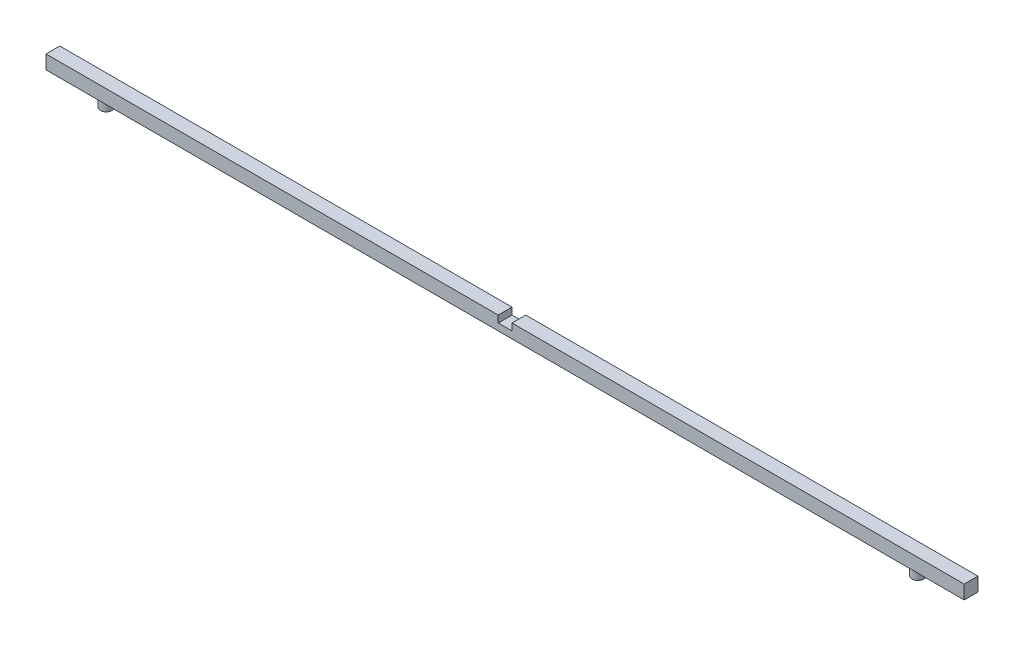
ISO-10303-21;
HEADER;
FILE_DESCRIPTION(('STEP AP214'),'2;1');
FILE_NAME('part.step','',(''),(''),'','','');
FILE_SCHEMA(('AUTOMOTIVE_DESIGN { 1 0 10303 214 1 1 1 1 }'));
ENDSEC;
DATA;
#1=APPLICATION_CONTEXT('core data for automotive mechanical design processes');
#2=APPLICATION_PROTOCOL_DEFINITION('international standard','automotive_design',2000,#1);
#3=PRODUCT_CONTEXT('',#1,'mechanical');
#4=PRODUCT('Part','Part','',(#3));
#5=PRODUCT_RELATED_PRODUCT_CATEGORY('part','',(#4));
#6=PRODUCT_DEFINITION_FORMATION('','',#4);
#7=PRODUCT_DEFINITION_CONTEXT('part definition',#1,'design');
#8=PRODUCT_DEFINITION('design','',#6,#7);
#9=PRODUCT_DEFINITION_SHAPE('','',#8);
#10=(LENGTH_UNIT() NAMED_UNIT(*) SI_UNIT(.MILLI.,.METRE.));
#11=(NAMED_UNIT(*) PLANE_ANGLE_UNIT() SI_UNIT($,.RADIAN.));
#12=(NAMED_UNIT(*) SI_UNIT($,.STERADIAN.) SOLID_ANGLE_UNIT());
#13=UNCERTAINTY_MEASURE_WITH_UNIT(LENGTH_MEASURE(1.E-05),#10,'distance_accuracy_value','');
#14=(GEOMETRIC_REPRESENTATION_CONTEXT(3) GLOBAL_UNCERTAINTY_ASSIGNED_CONTEXT((#13)) GLOBAL_UNIT_ASSIGNED_CONTEXT((#10,
#11,#12)) REPRESENTATION_CONTEXT('',''));
#15=CARTESIAN_POINT('',(0.,0.,0.));
#16=DIRECTION('',(0.,0.,1.));
#17=DIRECTION('',(1.,0.,0.));
#18=AXIS2_PLACEMENT_3D('',#15,#16,#17);
#19=CARTESIAN_POINT('',(-1000.,0.,30.));
#20=DIRECTION('',(0.,1.,0.));
#21=DIRECTION('',(-1.,0.,0.));
#22=AXIS2_PLACEMENT_3D('',#19,#20,#21);
#23=PLANE('',#22);
#24=CARTESIAN_POINT('',(-883.883476483184,0.,15.));
#25=DIRECTION('',(0.,1.,0.));
#26=DIRECTION('',(-1.,0.,0.));
#27=AXIS2_PLACEMENT_3D('',#24,#25,#26);
#28=CIRCLE('',#27,12.5);
#29=CARTESIAN_POINT('',(-896.383476483184,0.,15.));
#30=VERTEX_POINT('',#29);
#31=EDGE_CURVE('E49',#30,#30,#28,.F.);
#32=ORIENTED_EDGE('',*,*,#31,.F.);
#33=EDGE_LOOP('',(#32));
#34=FACE_BOUND('',#33,.T.);
#35=DIRECTION('',(1.,0.,0.));
#36=VECTOR('',#35,1.);
#37=CARTESIAN_POINT('',(-1000.,0.,0.));
#38=LINE('',#37,#36);
#39=CARTESIAN_POINT('',(-1000.,0.,0.));
#40=VERTEX_POINT('',#39);
#41=CARTESIAN_POINT('',(1000.,2.4980018054066E-13,0.));
#42=VERTEX_POINT('',#41);
#43=EDGE_CURVE('E146',#40,#42,#38,.T.);
#44=ORIENTED_EDGE('',*,*,#43,.T.);
#45=DIRECTION('',(0.,0.,-1.));
#46=VECTOR('',#45,1.);
#47=CARTESIAN_POINT('',(1000.,2.4980018054066E-13,30.));
#48=LINE('',#47,#46);
#49=CARTESIAN_POINT('',(1000.,2.4980018054066E-13,30.));
#50=VERTEX_POINT('',#49);
#51=EDGE_CURVE('E180',#50,#42,#48,.T.);
#52=ORIENTED_EDGE('',*,*,#51,.F.);
#53=DIRECTION('',(1.,0.,0.));
#54=VECTOR('',#53,1.);
#55=CARTESIAN_POINT('',(-1000.,0.,30.));
#56=LINE('',#55,#54);
#57=CARTESIAN_POINT('',(-1000.,0.,30.));
#58=VERTEX_POINT('',#57);
#59=EDGE_CURVE('E101',#58,#50,#56,.T.);
#60=ORIENTED_EDGE('',*,*,#59,.F.);
#61=DIRECTION('',(0.,0.,-1.));
#62=VECTOR('',#61,1.);
#63=CARTESIAN_POINT('',(-1000.,0.,30.));
#64=LINE('',#63,#62);
#65=EDGE_CURVE('E184',#58,#40,#64,.T.);
#66=ORIENTED_EDGE('',*,*,#65,.T.);
#67=EDGE_LOOP('',(#44,#52,#60,#66));
#68=FACE_BOUND('',#67,.T.);
#69=CARTESIAN_POINT('',(883.883476483184,2.35922392732846E-13,15.0000000000001));
#70=DIRECTION('',(0.,1.,0.));
#71=DIRECTION('',(-1.,0.,0.));
#72=AXIS2_PLACEMENT_3D('',#69,#70,#71);
#73=CIRCLE('',#72,12.5);
#74=CARTESIAN_POINT('',(871.383476483184,2.34361141604467E-13,15.0000000000001));
#75=VERTEX_POINT('',#74);
#76=EDGE_CURVE('E11',#75,#75,#73,.F.);
#77=ORIENTED_EDGE('',*,*,#76,.F.);
#78=EDGE_LOOP('',(#77));
#79=FACE_BOUND('',#78,.T.);
#80=ADVANCED_FACE('F39',(#34,#68,#79),#23,.F.);
#81=CARTESIAN_POINT('',(-1000.,30.,30.));
#82=DIRECTION('',(1.,0.,0.));
#83=DIRECTION('',(0.,0.,-1.));
#84=AXIS2_PLACEMENT_3D('',#81,#82,#83);
#85=PLANE('',#84);
#86=DIRECTION('',(0.,-1.,0.));
#87=VECTOR('',#86,1.);
#88=CARTESIAN_POINT('',(-1000.,30.,0.));
#89=LINE('',#88,#87);
#90=CARTESIAN_POINT('',(-1000.,30.,0.));
#91=VERTEX_POINT('',#90);
#92=EDGE_CURVE('E142',#91,#40,#89,.T.);
#93=ORIENTED_EDGE('',*,*,#92,.T.);
#94=ORIENTED_EDGE('',*,*,#65,.F.);
#95=DIRECTION('',(0.,-1.,0.));
#96=VECTOR('',#95,1.);
#97=CARTESIAN_POINT('',(-1000.,30.,30.));
#98=LINE('',#97,#96);
#99=CARTESIAN_POINT('',(-1000.,30.,30.));
#100=VERTEX_POINT('',#99);
#101=EDGE_CURVE('E165',#100,#58,#98,.T.);
#102=ORIENTED_EDGE('',*,*,#101,.F.);
#103=DIRECTION('',(0.,0.,-1.));
#104=VECTOR('',#103,1.);
#105=CARTESIAN_POINT('',(-1000.,30.,30.));
#106=LINE('',#105,#104);
#107=EDGE_CURVE('E138',#100,#91,#106,.T.);
#108=ORIENTED_EDGE('',*,*,#107,.T.);
#109=EDGE_LOOP('',(#93,#94,#102,#108));
#110=FACE_BOUND('',#109,.T.);
#111=ADVANCED_FACE('F41',(#110),#85,.F.);
#112=CARTESIAN_POINT('',(1000.,29.9999999999998,30.));
#113=DIRECTION('',(-1.,0.,0.));
#114=DIRECTION('',(0.,0.,1.));
#115=AXIS2_PLACEMENT_3D('',#112,#113,#114);
#116=PLANE('',#115);
#117=DIRECTION('',(0.,1.,0.));
#118=VECTOR('',#117,1.);
#119=CARTESIAN_POINT('',(1000.,29.9999999999998,0.));
#120=LINE('',#119,#118);
#121=CARTESIAN_POINT('',(1000.,29.9999999999998,0.));
#122=VERTEX_POINT('',#121);
#123=EDGE_CURVE('E150',#42,#122,#120,.T.);
#124=ORIENTED_EDGE('',*,*,#123,.T.);
#125=DIRECTION('',(0.,0.,-1.));
#126=VECTOR('',#125,1.);
#127=CARTESIAN_POINT('',(1000.,29.9999999999998,30.));
#128=LINE('',#127,#126);
#129=CARTESIAN_POINT('',(1000.,29.9999999999998,30.));
#130=VERTEX_POINT('',#129);
#131=EDGE_CURVE('E176',#130,#122,#128,.T.);
#132=ORIENTED_EDGE('',*,*,#131,.F.);
#133=DIRECTION('',(0.,1.,0.));
#134=VECTOR('',#133,1.);
#135=CARTESIAN_POINT('',(1000.,29.9999999999998,30.));
#136=LINE('',#135,#134);
#137=EDGE_CURVE('E270',#50,#130,#136,.T.);
#138=ORIENTED_EDGE('',*,*,#137,.F.);
#139=ORIENTED_EDGE('',*,*,#51,.T.);
#140=EDGE_LOOP('',(#124,#132,#138,#139));
#141=FACE_BOUND('',#140,.T.);
#142=ADVANCED_FACE('F251',(#141),#116,.F.);
#143=CARTESIAN_POINT('',(15.,30.,30.));
#144=DIRECTION('',(0.,-1.,0.));
#145=DIRECTION('',(1.,0.,0.));
#146=AXIS2_PLACEMENT_3D('',#143,#144,#145);
#147=PLANE('',#146);
#148=DIRECTION('',(-1.,0.,0.));
#149=VECTOR('',#148,1.);
#150=CARTESIAN_POINT('',(15.,30.,0.));
#151=LINE('',#150,#149);
#152=CARTESIAN_POINT('',(15.,30.,0.));
#153=VERTEX_POINT('',#152);
#154=EDGE_CURVE('E153',#122,#153,#151,.T.);
#155=ORIENTED_EDGE('',*,*,#154,.T.);
#156=DIRECTION('',(0.,0.,-1.));
#157=VECTOR('',#156,1.);
#158=CARTESIAN_POINT('',(15.,30.,30.));
#159=LINE('',#158,#157);
#160=CARTESIAN_POINT('',(15.,30.,30.));
#161=VERTEX_POINT('',#160);
#162=EDGE_CURVE('E172',#161,#153,#159,.T.);
#163=ORIENTED_EDGE('',*,*,#162,.F.);
#164=DIRECTION('',(-1.,0.,0.));
#165=VECTOR('',#164,1.);
#166=CARTESIAN_POINT('',(15.,30.,30.));
#167=LINE('',#166,#165);
#168=EDGE_CURVE('E265',#130,#161,#167,.T.);
#169=ORIENTED_EDGE('',*,*,#168,.F.);
#170=ORIENTED_EDGE('',*,*,#131,.T.);
#171=EDGE_LOOP('',(#155,#163,#169,#170));
#172=FACE_BOUND('',#171,.T.);
#173=ADVANCED_FACE('F247',(#172),#147,.F.);
#174=CARTESIAN_POINT('',(15.,15.,30.));
#175=DIRECTION('',(1.,0.,0.));
#176=DIRECTION('',(0.,1.,0.));
#177=AXIS2_PLACEMENT_3D('',#174,#175,#176);
#178=PLANE('',#177);
#179=DIRECTION('',(0.,-1.,0.));
#180=VECTOR('',#179,1.);
#181=CARTESIAN_POINT('',(15.,15.,0.));
#182=LINE('',#181,#180);
#183=CARTESIAN_POINT('',(15.,15.,0.));
#184=VERTEX_POINT('',#183);
#185=EDGE_CURVE('E156',#153,#184,#182,.T.);
#186=ORIENTED_EDGE('',*,*,#185,.T.);
#187=DIRECTION('',(0.,0.,-1.));
#188=VECTOR('',#187,1.);
#189=CARTESIAN_POINT('',(15.,15.,30.));
#190=LINE('',#189,#188);
#191=CARTESIAN_POINT('',(15.,15.,30.));
#192=VERTEX_POINT('',#191);
#193=EDGE_CURVE('E131',#192,#184,#190,.T.);
#194=ORIENTED_EDGE('',*,*,#193,.F.);
#195=DIRECTION('',(0.,-1.,0.));
#196=VECTOR('',#195,1.);
#197=CARTESIAN_POINT('',(15.,15.,30.));
#198=LINE('',#197,#196);
#199=EDGE_CURVE('E120',#161,#192,#198,.T.);
#200=ORIENTED_EDGE('',*,*,#199,.F.);
#201=ORIENTED_EDGE('',*,*,#162,.T.);
#202=EDGE_LOOP('',(#186,#194,#200,#201));
#203=FACE_BOUND('',#202,.T.);
#204=ADVANCED_FACE('F244',(#203),#178,.F.);
#205=CARTESIAN_POINT('',(-15.,15.,30.));
#206=DIRECTION('',(0.,-1.,0.));
#207=DIRECTION('',(1.,0.,0.));
#208=AXIS2_PLACEMENT_3D('',#205,#206,#207);
#209=PLANE('',#208);
#210=DIRECTION('',(-1.,0.,0.));
#211=VECTOR('',#210,1.);
#212=CARTESIAN_POINT('',(-15.,15.,0.));
#213=LINE('',#212,#211);
#214=CARTESIAN_POINT('',(-15.,15.,0.));
#215=VERTEX_POINT('',#214);
#216=EDGE_CURVE('E129',#184,#215,#213,.T.);
#217=ORIENTED_EDGE('',*,*,#216,.T.);
#218=DIRECTION('',(0.,0.,-1.));
#219=VECTOR('',#218,1.);
#220=CARTESIAN_POINT('',(-15.,15.,30.));
#221=LINE('',#220,#219);
#222=CARTESIAN_POINT('',(-15.,15.,30.));
#223=VERTEX_POINT('',#222);
#224=EDGE_CURVE('E126',#223,#215,#221,.T.);
#225=ORIENTED_EDGE('',*,*,#224,.F.);
#226=DIRECTION('',(-1.,0.,0.));
#227=VECTOR('',#226,1.);
#228=CARTESIAN_POINT('',(-15.,15.,30.));
#229=LINE('',#228,#227);
#230=EDGE_CURVE('E114',#192,#223,#229,.T.);
#231=ORIENTED_EDGE('',*,*,#230,.F.);
#232=ORIENTED_EDGE('',*,*,#193,.T.);
#233=EDGE_LOOP('',(#217,#225,#231,#232));
#234=FACE_BOUND('',#233,.T.);
#235=ADVANCED_FACE('F127',(#234),#209,.F.);
#236=CARTESIAN_POINT('',(-15.,30.,30.));
#237=DIRECTION('',(-1.,0.,0.));
#238=DIRECTION('',(0.,-1.,0.));
#239=AXIS2_PLACEMENT_3D('',#236,#237,#238);
#240=PLANE('',#239);
#241=DIRECTION('',(0.,1.,0.));
#242=VECTOR('',#241,1.);
#243=CARTESIAN_POINT('',(-15.,30.,0.));
#244=LINE('',#243,#242);
#245=CARTESIAN_POINT('',(-15.,30.,0.));
#246=VERTEX_POINT('',#245);
#247=EDGE_CURVE('E86',#215,#246,#244,.T.);
#248=ORIENTED_EDGE('',*,*,#247,.T.);
#249=DIRECTION('',(0.,0.,-1.));
#250=VECTOR('',#249,1.);
#251=CARTESIAN_POINT('',(-15.,30.,30.));
#252=LINE('',#251,#250);
#253=CARTESIAN_POINT('',(-15.,30.,30.));
#254=VERTEX_POINT('',#253);
#255=EDGE_CURVE('E132',#254,#246,#252,.T.);
#256=ORIENTED_EDGE('',*,*,#255,.F.);
#257=DIRECTION('',(0.,1.,0.));
#258=VECTOR('',#257,1.);
#259=CARTESIAN_POINT('',(-15.,30.,30.));
#260=LINE('',#259,#258);
#261=EDGE_CURVE('E118',#223,#254,#260,.T.);
#262=ORIENTED_EDGE('',*,*,#261,.F.);
#263=ORIENTED_EDGE('',*,*,#224,.T.);
#264=EDGE_LOOP('',(#248,#256,#262,#263));
#265=FACE_BOUND('',#264,.T.);
#266=ADVANCED_FACE('F134',(#265),#240,.F.);
#267=CARTESIAN_POINT('',(-1000.,30.,30.));
#268=DIRECTION('',(0.,-1.,0.));
#269=DIRECTION('',(1.,0.,0.));
#270=AXIS2_PLACEMENT_3D('',#267,#268,#269);
#271=PLANE('',#270);
#272=DIRECTION('',(-1.,0.,0.));
#273=VECTOR('',#272,1.);
#274=CARTESIAN_POINT('',(-1000.,30.,0.));
#275=LINE('',#274,#273);
#276=EDGE_CURVE('E92',#246,#91,#275,.T.);
#277=ORIENTED_EDGE('',*,*,#276,.T.);
#278=ORIENTED_EDGE('',*,*,#107,.F.);
#279=DIRECTION('',(-1.,0.,0.));
#280=VECTOR('',#279,1.);
#281=CARTESIAN_POINT('',(-1000.,30.,30.));
#282=LINE('',#281,#280);
#283=EDGE_CURVE('E57',#254,#100,#282,.T.);
#284=ORIENTED_EDGE('',*,*,#283,.F.);
#285=ORIENTED_EDGE('',*,*,#255,.T.);
#286=EDGE_LOOP('',(#277,#278,#284,#285));
#287=FACE_BOUND('',#286,.T.);
#288=ADVANCED_FACE('F234',(#287),#271,.F.);
#289=CARTESIAN_POINT('',(0.,0.,30.));
#290=DIRECTION('',(0.,0.,1.));
#291=DIRECTION('',(1.,0.,0.));
#292=AXIS2_PLACEMENT_3D('',#289,#290,#291);
#293=PLANE('',#292);
#294=ORIENTED_EDGE('',*,*,#101,.T.);
#295=ORIENTED_EDGE('',*,*,#59,.T.);
#296=ORIENTED_EDGE('',*,*,#137,.T.);
#297=ORIENTED_EDGE('',*,*,#168,.T.);
#298=ORIENTED_EDGE('',*,*,#199,.T.);
#299=ORIENTED_EDGE('',*,*,#230,.T.);
#300=ORIENTED_EDGE('',*,*,#261,.T.);
#301=ORIENTED_EDGE('',*,*,#283,.T.);
#302=EDGE_LOOP('',(#294,#295,#296,#297,#298,#299,#300,#301));
#303=FACE_BOUND('',#302,.T.);
#304=ADVANCED_FACE('F116',(#303),#293,.T.);
#305=CARTESIAN_POINT('',(0.,0.,0.));
#306=DIRECTION('',(0.,0.,1.));
#307=DIRECTION('',(1.,0.,0.));
#308=AXIS2_PLACEMENT_3D('',#305,#306,#307);
#309=PLANE('',#308);
#310=ORIENTED_EDGE('',*,*,#92,.F.);
#311=ORIENTED_EDGE('',*,*,#276,.F.);
#312=ORIENTED_EDGE('',*,*,#247,.F.);
#313=ORIENTED_EDGE('',*,*,#216,.F.);
#314=ORIENTED_EDGE('',*,*,#185,.F.);
#315=ORIENTED_EDGE('',*,*,#154,.F.);
#316=ORIENTED_EDGE('',*,*,#123,.F.);
#317=ORIENTED_EDGE('',*,*,#43,.F.);
#318=EDGE_LOOP('',(#310,#311,#312,#313,#314,#315,#316,#317));
#319=FACE_BOUND('',#318,.T.);
#320=ADVANCED_FACE('F217',(#319),#309,.F.);
#321=CARTESIAN_POINT('',(-883.883476483184,-20.0000000000001,15.));
#322=DIRECTION('',(0.,-1.,0.));
#323=DIRECTION('',(1.,0.,0.));
#324=AXIS2_PLACEMENT_3D('',#321,#322,#323);
#325=PLANE('',#324);
#326=CARTESIAN_POINT('',(-883.883476483184,-20.0000000000001,15.));
#327=DIRECTION('',(0.,-1.,0.));
#328=DIRECTION('',(1.,0.,0.));
#329=AXIS2_PLACEMENT_3D('',#326,#327,#328);
#330=CIRCLE('',#329,12.5);
#331=CARTESIAN_POINT('',(-871.383476483184,-20.0000000000001,15.));
#332=VERTEX_POINT('',#331);
#333=EDGE_CURVE('E283',#332,#332,#330,.T.);
#334=ORIENTED_EDGE('',*,*,#333,.T.);
#335=EDGE_LOOP('',(#334));
#336=FACE_BOUND('',#335,.T.);
#337=CARTESIAN_POINT('',(-883.883476483184,-20.0000000000001,15.));
#338=DIRECTION('',(0.,-1.,0.));
#339=DIRECTION('',(1.,0.,0.));
#340=AXIS2_PLACEMENT_3D('',#337,#338,#339);
#341=CIRCLE('',#340,9.99999999999998);
#342=CARTESIAN_POINT('',(-873.883476483184,-20.0000000000001,15.));
#343=VERTEX_POINT('',#342);
#344=EDGE_CURVE('E290',#343,#343,#341,.T.);
#345=ORIENTED_EDGE('',*,*,#344,.F.);
#346=EDGE_LOOP('',(#345));
#347=FACE_BOUND('',#346,.T.);
#348=ADVANCED_FACE('F214',(#336,#347),#325,.T.);
#349=CARTESIAN_POINT('',(-883.883476483184,-20.0000000000001,15.));
#350=DIRECTION('',(0.,1.,0.));
#351=DIRECTION('',(-1.,0.,0.));
#352=AXIS2_PLACEMENT_3D('',#349,#350,#351);
#353=CYLINDRICAL_SURFACE('',#352,12.5);
#354=ORIENTED_EDGE('',*,*,#333,.F.);
#355=EDGE_LOOP('',(#354));
#356=FACE_BOUND('',#355,.T.);
#357=ORIENTED_EDGE('',*,*,#31,.T.);
#358=EDGE_LOOP('',(#357));
#359=FACE_BOUND('',#358,.T.);
#360=ADVANCED_FACE('F190',(#356,#359),#353,.T.);
#361=CARTESIAN_POINT('',(-883.883476483184,14.9999999999999,15.));
#362=DIRECTION('',(0.,-1.,0.));
#363=DIRECTION('',(1.,0.,0.));
#364=AXIS2_PLACEMENT_3D('',#361,#362,#363);
#365=PLANE('',#364);
#366=CARTESIAN_POINT('',(-883.883476483184,14.9999999999999,15.));
#367=DIRECTION('',(0.,-1.,0.));
#368=DIRECTION('',(1.,0.,0.));
#369=AXIS2_PLACEMENT_3D('',#366,#367,#368);
#370=CIRCLE('',#369,9.99999999999998);
#371=CARTESIAN_POINT('',(-873.883476483184,14.9999999999999,15.));
#372=VERTEX_POINT('',#371);
#373=EDGE_CURVE('E147',#372,#372,#370,.T.);
#374=ORIENTED_EDGE('',*,*,#373,.T.);
#375=EDGE_LOOP('',(#374));
#376=FACE_BOUND('',#375,.T.);
#377=ADVANCED_FACE('F221',(#376),#365,.T.);
#378=CARTESIAN_POINT('',(-883.883476483184,14.9999999999999,15.));
#379=DIRECTION('',(0.,-1.,0.));
#380=DIRECTION('',(1.,0.,0.));
#381=AXIS2_PLACEMENT_3D('',#378,#379,#380);
#382=CYLINDRICAL_SURFACE('',#381,9.99999999999998);
#383=ORIENTED_EDGE('',*,*,#373,.F.);
#384=EDGE_LOOP('',(#383));
#385=FACE_BOUND('',#384,.T.);
#386=ORIENTED_EDGE('',*,*,#344,.T.);
#387=EDGE_LOOP('',(#386));
#388=FACE_BOUND('',#387,.T.);
#389=ADVANCED_FACE('F209',(#385,#388),#382,.F.);
#390=CARTESIAN_POINT('',(883.883476483184,-19.9999999999999,15.0000000000001));
#391=DIRECTION('',(0.,1.,0.));
#392=DIRECTION('',(-1.,0.,0.));
#393=AXIS2_PLACEMENT_3D('',#390,#391,#392);
#394=PLANE('',#393);
#395=CARTESIAN_POINT('',(883.883476483184,-19.9999999999999,15.0000000000001));
#396=DIRECTION('',(0.,-1.,0.));
#397=DIRECTION('',(-1.,0.,0.));
#398=AXIS2_PLACEMENT_3D('',#395,#396,#397);
#399=CIRCLE('',#398,12.5);
#400=CARTESIAN_POINT('',(871.383476483184,-19.9999999999999,15.0000000000001));
#401=VERTEX_POINT('',#400);
#402=EDGE_CURVE('E294',#401,#401,#399,.T.);
#403=ORIENTED_EDGE('',*,*,#402,.T.);
#404=EDGE_LOOP('',(#403));
#405=FACE_BOUND('',#404,.T.);
#406=CARTESIAN_POINT('',(883.883476483184,-19.9999999999999,15.0000000000001));
#407=DIRECTION('',(0.,-1.,0.));
#408=DIRECTION('',(-1.,0.,0.));
#409=AXIS2_PLACEMENT_3D('',#406,#407,#408);
#410=CIRCLE('',#409,9.99999999999998);
#411=CARTESIAN_POINT('',(873.883476483184,-19.9999999999999,15.0000000000001));
#412=VERTEX_POINT('',#411);
#413=EDGE_CURVE('E298',#412,#412,#410,.T.);
#414=ORIENTED_EDGE('',*,*,#413,.F.);
#415=EDGE_LOOP('',(#414));
#416=FACE_BOUND('',#415,.T.);
#417=ADVANCED_FACE('F199',(#405,#416),#394,.F.);
#418=CARTESIAN_POINT('',(883.883476483184,-19.9999999999999,15.0000000000001));
#419=DIRECTION('',(0.,1.,0.));
#420=DIRECTION('',(-1.,0.,0.));
#421=AXIS2_PLACEMENT_3D('',#418,#419,#420);
#422=CYLINDRICAL_SURFACE('',#421,12.5);
#423=ORIENTED_EDGE('',*,*,#402,.F.);
#424=EDGE_LOOP('',(#423));
#425=FACE_BOUND('',#424,.T.);
#426=ORIENTED_EDGE('',*,*,#76,.T.);
#427=EDGE_LOOP('',(#426));
#428=FACE_BOUND('',#427,.T.);
#429=ADVANCED_FACE('F196',(#425,#428),#422,.T.);
#430=CARTESIAN_POINT('',(883.883476483184,15.0000000000001,15.));
#431=DIRECTION('',(0.,1.,0.));
#432=DIRECTION('',(-1.,0.,0.));
#433=AXIS2_PLACEMENT_3D('',#430,#431,#432);
#434=PLANE('',#433);
#435=CARTESIAN_POINT('',(883.883476483184,15.0000000000001,15.));
#436=DIRECTION('',(0.,-1.,0.));
#437=DIRECTION('',(-1.,0.,0.));
#438=AXIS2_PLACEMENT_3D('',#435,#436,#437);
#439=CIRCLE('',#438,9.99999999999998);
#440=CARTESIAN_POINT('',(873.883476483184,15.0000000000001,15.));
#441=VERTEX_POINT('',#440);
#442=EDGE_CURVE('E279',#441,#441,#439,.T.);
#443=ORIENTED_EDGE('',*,*,#442,.T.);
#444=EDGE_LOOP('',(#443));
#445=FACE_BOUND('',#444,.T.);
#446=ADVANCED_FACE('F198',(#445),#434,.F.);
#447=CARTESIAN_POINT('',(883.883476483184,15.0000000000001,15.));
#448=DIRECTION('',(0.,-1.,0.));
#449=DIRECTION('',(1.,0.,0.));
#450=AXIS2_PLACEMENT_3D('',#447,#448,#449);
#451=CYLINDRICAL_SURFACE('',#450,9.99999999999998);
#452=ORIENTED_EDGE('',*,*,#442,.F.);
#453=EDGE_LOOP('',(#452));
#454=FACE_BOUND('',#453,.T.);
#455=ORIENTED_EDGE('',*,*,#413,.T.);
#456=EDGE_LOOP('',(#455));
#457=FACE_BOUND('',#456,.T.);
#458=ADVANCED_FACE('F206',(#454,#457),#451,.F.);
#459=CLOSED_SHELL('',(#80,#111,#142,#173,#204,#235,#266,#288,#304,#320,#348,#360,#377,#389,#417,
#429,#446,#458));
#460=MANIFOLD_SOLID_BREP('B2',#459);
#461=ADVANCED_BREP_SHAPE_REPRESENTATION('',(#18,#460),#14);
#462=SHAPE_DEFINITION_REPRESENTATION(#9,#461);
ENDSEC;
END-ISO-10303-21;
